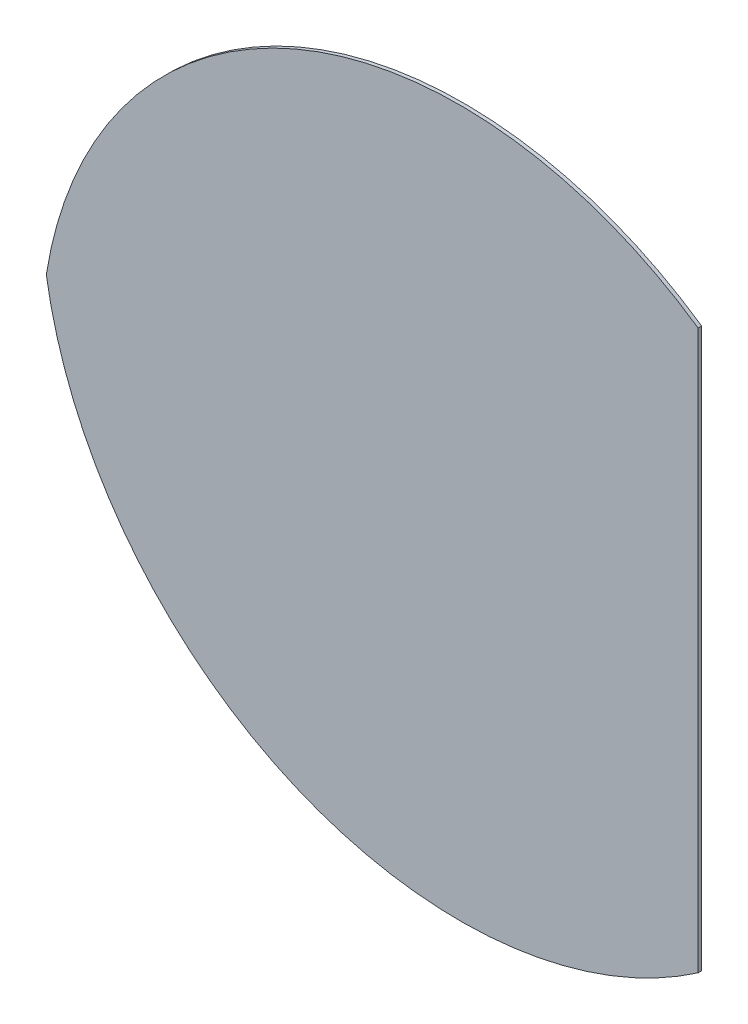
ISO-10303-21;
HEADER;
FILE_DESCRIPTION(('STEP AP214'),'2;1');
FILE_NAME('part.step','',(''),(''),'','','');
FILE_SCHEMA(('AUTOMOTIVE_DESIGN { 1 0 10303 214 1 1 1 1 }'));
ENDSEC;
DATA;
#1=APPLICATION_CONTEXT('core data for automotive mechanical design processes');
#2=APPLICATION_PROTOCOL_DEFINITION('international standard','automotive_design',2000,#1);
#3=PRODUCT_CONTEXT('',#1,'mechanical');
#4=PRODUCT('Part','Part','',(#3));
#5=PRODUCT_RELATED_PRODUCT_CATEGORY('part','',(#4));
#6=PRODUCT_DEFINITION_FORMATION('','',#4);
#7=PRODUCT_DEFINITION_CONTEXT('part definition',#1,'design');
#8=PRODUCT_DEFINITION('design','',#6,#7);
#9=PRODUCT_DEFINITION_SHAPE('','',#8);
#10=(LENGTH_UNIT() NAMED_UNIT(*) SI_UNIT(.MILLI.,.METRE.));
#11=(NAMED_UNIT(*) PLANE_ANGLE_UNIT() SI_UNIT($,.RADIAN.));
#12=(NAMED_UNIT(*) SI_UNIT($,.STERADIAN.) SOLID_ANGLE_UNIT());
#13=UNCERTAINTY_MEASURE_WITH_UNIT(LENGTH_MEASURE(1.E-05),#10,'distance_accuracy_value','');
#14=(GEOMETRIC_REPRESENTATION_CONTEXT(3) GLOBAL_UNCERTAINTY_ASSIGNED_CONTEXT((#13)) GLOBAL_UNIT_ASSIGNED_CONTEXT((#10,
#11,#12)) REPRESENTATION_CONTEXT('',''));
#15=CARTESIAN_POINT('',(0.,0.,0.));
#16=DIRECTION('',(0.,0.,1.));
#17=DIRECTION('',(1.,0.,0.));
#18=AXIS2_PLACEMENT_3D('',#15,#16,#17);
#19=CARTESIAN_POINT('',(-46.0168081317303,-6.67724877028018,1.));
#20=DIRECTION('',(0.,0.,-1.));
#21=DIRECTION('',(-1.,0.,0.));
#22=AXIS2_PLACEMENT_3D('',#19,#20,#21);
#23=CYLINDRICAL_SURFACE('',#22,118.378204081276);
#24=CARTESIAN_POINT('',(-46.0168081317303,-6.67724877028018,0.));
#25=DIRECTION('',(0.,0.,1.));
#26=DIRECTION('',(-1.,0.,0.));
#27=AXIS2_PLACEMENT_3D('',#24,#25,#26);
#28=CIRCLE('',#27,118.378204081276);
#29=CARTESIAN_POINT('',(21.1963799484794,90.7690777361748,0.));
#30=VERTEX_POINT('',#29);
#31=CARTESIAN_POINT('',(-162.953509903785,11.7403238217261,0.));
#32=VERTEX_POINT('',#31);
#33=EDGE_CURVE('E89',#30,#32,#28,.T.);
#34=ORIENTED_EDGE('',*,*,#33,.T.);
#35=DIRECTION('',(0.,0.,-1.));
#36=VECTOR('',#35,1.);
#37=CARTESIAN_POINT('',(-162.953509903785,11.7403238217261,1.));
#38=LINE('',#37,#36);
#39=CARTESIAN_POINT('',(-162.953509903785,11.7403238217261,1.));
#40=VERTEX_POINT('',#39);
#41=EDGE_CURVE('E11',#40,#32,#38,.T.);
#42=ORIENTED_EDGE('',*,*,#41,.F.);
#43=CARTESIAN_POINT('',(-46.0168081317303,-6.67724877028018,1.));
#44=DIRECTION('',(0.,0.,1.));
#45=DIRECTION('',(-1.,0.,0.));
#46=AXIS2_PLACEMENT_3D('',#43,#44,#45);
#47=CIRCLE('',#46,118.378204081276);
#48=CARTESIAN_POINT('',(21.1963799484794,90.7690777361748,1.));
#49=VERTEX_POINT('',#48);
#50=EDGE_CURVE('E81',#49,#40,#47,.T.);
#51=ORIENTED_EDGE('',*,*,#50,.F.);
#52=DIRECTION('',(0.,0.,-1.));
#53=VECTOR('',#52,1.);
#54=CARTESIAN_POINT('',(21.1963799484794,90.7690777361748,1.));
#55=LINE('',#54,#53);
#56=EDGE_CURVE('E90',#49,#30,#55,.T.);
#57=ORIENTED_EDGE('',*,*,#56,.T.);
#58=EDGE_LOOP('',(#34,#42,#51,#57));
#59=FACE_BOUND('',#58,.T.);
#60=ADVANCED_FACE('F39',(#59),#23,.T.);
#61=CARTESIAN_POINT('',(-46.0168081317303,30.5501950591195,1.));
#62=DIRECTION('',(0.,0.,-1.));
#63=DIRECTION('',(-1.,0.,0.));
#64=AXIS2_PLACEMENT_3D('',#61,#62,#63);
#65=CYLINDRICAL_SURFACE('',#64,118.439872835518);
#66=CARTESIAN_POINT('',(-46.0168081317303,30.5501950591195,0.));
#67=DIRECTION('',(0.,0.,1.));
#68=DIRECTION('',(-1.,0.,0.));
#69=AXIS2_PLACEMENT_3D('',#66,#67,#68);
#70=CIRCLE('',#69,118.439872835518);
#71=CARTESIAN_POINT('',(21.1963799512411,-66.9710376290335,0.));
#72=VERTEX_POINT('',#71);
#73=EDGE_CURVE('E68',#32,#72,#70,.T.);
#74=ORIENTED_EDGE('',*,*,#73,.T.);
#75=DIRECTION('',(0.,0.,-1.));
#76=VECTOR('',#75,1.);
#77=CARTESIAN_POINT('',(21.1963799512411,-66.9710376290335,1.));
#78=LINE('',#77,#76);
#79=CARTESIAN_POINT('',(21.1963799512411,-66.9710376290335,1.));
#80=VERTEX_POINT('',#79);
#81=EDGE_CURVE('E48',#80,#72,#78,.T.);
#82=ORIENTED_EDGE('',*,*,#81,.F.);
#83=CARTESIAN_POINT('',(-46.0168081317303,30.5501950591195,1.));
#84=DIRECTION('',(0.,0.,1.));
#85=DIRECTION('',(-1.,0.,0.));
#86=AXIS2_PLACEMENT_3D('',#83,#84,#85);
#87=CIRCLE('',#86,118.439872835518);
#88=EDGE_CURVE('E76',#40,#80,#87,.T.);
#89=ORIENTED_EDGE('',*,*,#88,.F.);
#90=ORIENTED_EDGE('',*,*,#41,.T.);
#91=EDGE_LOOP('',(#74,#82,#89,#90));
#92=FACE_BOUND('',#91,.T.);
#93=ADVANCED_FACE('F77',(#92),#65,.T.);
#94=CARTESIAN_POINT('',(21.1963799484794,90.7690777361748,1.));
#95=DIRECTION('',(-1.,-1.75079593604749E-11,0.));
#96=DIRECTION('',(1.75079593604749E-11,-1.,0.));
#97=AXIS2_PLACEMENT_3D('',#94,#95,#96);
#98=PLANE('',#97);
#99=DIRECTION('',(-1.75079593604749E-11,1.,0.));
#100=VECTOR('',#99,1.);
#101=CARTESIAN_POINT('',(21.1963799484794,90.7690777361748,0.));
#102=LINE('',#101,#100);
#103=EDGE_CURVE('E73',#72,#30,#102,.T.);
#104=ORIENTED_EDGE('',*,*,#103,.T.);
#105=ORIENTED_EDGE('',*,*,#56,.F.);
#106=DIRECTION('',(-1.75079593604749E-11,1.,0.));
#107=VECTOR('',#106,1.);
#108=CARTESIAN_POINT('',(21.1963799484794,90.7690777361748,1.));
#109=LINE('',#108,#107);
#110=EDGE_CURVE('E56',#80,#49,#109,.T.);
#111=ORIENTED_EDGE('',*,*,#110,.F.);
#112=ORIENTED_EDGE('',*,*,#81,.T.);
#113=EDGE_LOOP('',(#104,#105,#111,#112));
#114=FACE_BOUND('',#113,.T.);
#115=ADVANCED_FACE('F102',(#114),#98,.F.);
#116=CARTESIAN_POINT('',(-46.0168081317303,-6.67724877028018,1.));
#117=DIRECTION('',(0.,0.,-1.));
#118=DIRECTION('',(-1.,0.,0.));
#119=AXIS2_PLACEMENT_3D('',#116,#117,#118);
#120=PLANE('',#119);
#121=ORIENTED_EDGE('',*,*,#50,.T.);
#122=ORIENTED_EDGE('',*,*,#88,.T.);
#123=ORIENTED_EDGE('',*,*,#110,.T.);
#124=EDGE_LOOP('',(#121,#122,#123));
#125=FACE_BOUND('',#124,.T.);
#126=ADVANCED_FACE('F84',(#125),#120,.F.);
#127=CARTESIAN_POINT('',(-46.0168081317303,-6.67724877028018,0.));
#128=DIRECTION('',(0.,0.,-1.));
#129=DIRECTION('',(-1.,0.,0.));
#130=AXIS2_PLACEMENT_3D('',#127,#128,#129);
#131=PLANE('',#130);
#132=ORIENTED_EDGE('',*,*,#33,.F.);
#133=ORIENTED_EDGE('',*,*,#103,.F.);
#134=ORIENTED_EDGE('',*,*,#73,.F.);
#135=EDGE_LOOP('',(#132,#133,#134));
#136=FACE_BOUND('',#135,.T.);
#137=ADVANCED_FACE('F103',(#136),#131,.T.);
#138=CLOSED_SHELL('',(#60,#93,#115,#126,#137));
#139=MANIFOLD_SOLID_BREP('B2',#138);
#140=ADVANCED_BREP_SHAPE_REPRESENTATION('',(#18,#139),#14);
#141=SHAPE_DEFINITION_REPRESENTATION(#9,#140);
ENDSEC;
END-ISO-10303-21;
